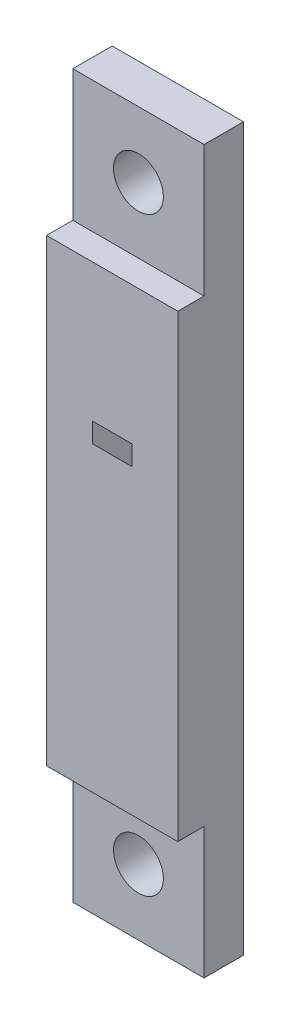
ISO-10303-21;
HEADER;
FILE_DESCRIPTION(('STEP AP214'),'2;1');
FILE_NAME('part.step','',(''),(''),'','','');
FILE_SCHEMA(('AUTOMOTIVE_DESIGN { 1 0 10303 214 1 1 1 1 }'));
ENDSEC;
DATA;
#1=APPLICATION_CONTEXT('core data for automotive mechanical design processes');
#2=APPLICATION_PROTOCOL_DEFINITION('international standard','automotive_design',2000,#1);
#3=PRODUCT_CONTEXT('',#1,'mechanical');
#4=PRODUCT('Part','Part','',(#3));
#5=PRODUCT_RELATED_PRODUCT_CATEGORY('part','',(#4));
#6=PRODUCT_DEFINITION_FORMATION('','',#4);
#7=PRODUCT_DEFINITION_CONTEXT('part definition',#1,'design');
#8=PRODUCT_DEFINITION('design','',#6,#7);
#9=PRODUCT_DEFINITION_SHAPE('','',#8);
#10=(LENGTH_UNIT() NAMED_UNIT(*) SI_UNIT(.MILLI.,.METRE.));
#11=(NAMED_UNIT(*) PLANE_ANGLE_UNIT() SI_UNIT($,.RADIAN.));
#12=(NAMED_UNIT(*) SI_UNIT($,.STERADIAN.) SOLID_ANGLE_UNIT());
#13=UNCERTAINTY_MEASURE_WITH_UNIT(LENGTH_MEASURE(1.E-05),#10,'distance_accuracy_value','');
#14=(GEOMETRIC_REPRESENTATION_CONTEXT(3) GLOBAL_UNCERTAINTY_ASSIGNED_CONTEXT((#13)) GLOBAL_UNIT_ASSIGNED_CONTEXT((#10,
#11,#12)) REPRESENTATION_CONTEXT('',''));
#15=CARTESIAN_POINT('',(0.,0.,0.));
#16=DIRECTION('',(0.,0.,1.));
#17=DIRECTION('',(1.,0.,0.));
#18=AXIS2_PLACEMENT_3D('',#15,#16,#17);
#19=CARTESIAN_POINT('',(0.,0.,13.5));
#20=DIRECTION('',(0.,0.,1.));
#21=DIRECTION('',(1.,0.,0.));
#22=AXIS2_PLACEMENT_3D('',#19,#20,#21);
#23=PLANE('',#22);
#24=CARTESIAN_POINT('',(-4.4209,22.5,13.5));
#25=DIRECTION('',(0.,0.,1.));
#26=DIRECTION('',(1.,0.,0.));
#27=AXIS2_PLACEMENT_3D('',#24,#25,#26);
#28=CIRCLE('',#27,1.9);
#29=CARTESIAN_POINT('',(-2.5209,22.5,13.5));
#30=VERTEX_POINT('',#29);
#31=EDGE_CURVE('E192',#30,#30,#28,.T.);
#32=ORIENTED_EDGE('',*,*,#31,.T.);
#33=EDGE_LOOP('',(#32));
#34=FACE_BOUND('',#33,.T.);
#35=CARTESIAN_POINT('',(-4.4209,-22.5,13.5));
#36=DIRECTION('',(0.,0.,1.));
#37=DIRECTION('',(1.,0.,0.));
#38=AXIS2_PLACEMENT_3D('',#35,#36,#37);
#39=CIRCLE('',#38,1.9);
#40=CARTESIAN_POINT('',(-2.5209,-22.5,13.5));
#41=VERTEX_POINT('',#40);
#42=EDGE_CURVE('E199',#41,#41,#39,.F.);
#43=ORIENTED_EDGE('',*,*,#42,.F.);
#44=EDGE_LOOP('',(#43));
#45=FACE_BOUND('',#44,.T.);
#46=DIRECTION('',(0.,-1.,0.));
#47=VECTOR('',#46,1.);
#48=CARTESIAN_POINT('',(0.579099999999996,0.,13.5));
#49=LINE('',#48,#47);
#50=CARTESIAN_POINT('',(0.579099999999992,27.5,13.5));
#51=VERTEX_POINT('',#50);
#52=CARTESIAN_POINT('',(0.579099999999999,-27.5,13.5));
#53=VERTEX_POINT('',#52);
#54=EDGE_CURVE('E218',#51,#53,#49,.T.);
#55=ORIENTED_EDGE('',*,*,#54,.T.);
#56=DIRECTION('',(1.,0.,0.));
#57=VECTOR('',#56,1.);
#58=CARTESIAN_POINT('',(0.,-27.5,13.5));
#59=LINE('',#58,#57);
#60=CARTESIAN_POINT('',(-9.4209,-27.5,13.5));
#61=VERTEX_POINT('',#60);
#62=EDGE_CURVE('E240',#61,#53,#59,.T.);
#63=ORIENTED_EDGE('',*,*,#62,.F.);
#64=DIRECTION('',(0.,-1.,0.));
#65=VECTOR('',#64,1.);
#66=CARTESIAN_POINT('',(-9.4209,0.,13.5));
#67=LINE('',#66,#65);
#68=CARTESIAN_POINT('',(-9.42090000000001,27.5,13.5));
#69=VERTEX_POINT('',#68);
#70=EDGE_CURVE('E249',#69,#61,#67,.T.);
#71=ORIENTED_EDGE('',*,*,#70,.F.);
#72=DIRECTION('',(1.,0.,0.));
#73=VECTOR('',#72,1.);
#74=CARTESIAN_POINT('',(0.,27.5,13.5));
#75=LINE('',#74,#73);
#76=EDGE_CURVE('E246',#69,#51,#75,.T.);
#77=ORIENTED_EDGE('',*,*,#76,.T.);
#78=EDGE_LOOP('',(#55,#63,#71,#77));
#79=FACE_BOUND('',#78,.T.);
#80=DIRECTION('',(0.,-1.,0.));
#81=VECTOR('',#80,1.);
#82=CARTESIAN_POINT('',(-5.9209,0.,13.5));
#83=LINE('',#82,#81);
#84=CARTESIAN_POINT('',(-5.9209,2.,13.5));
#85=VERTEX_POINT('',#84);
#86=CARTESIAN_POINT('',(-5.9209,-2.,13.5));
#87=VERTEX_POINT('',#86);
#88=EDGE_CURVE('E145',#85,#87,#83,.T.);
#89=ORIENTED_EDGE('',*,*,#88,.T.);
#90=DIRECTION('',(-1.,0.,0.));
#91=VECTOR('',#90,1.);
#92=CARTESIAN_POINT('',(0.,-2.,13.5));
#93=LINE('',#92,#91);
#94=CARTESIAN_POINT('',(-2.9209,-2.,13.5));
#95=VERTEX_POINT('',#94);
#96=EDGE_CURVE('E171',#95,#87,#93,.T.);
#97=ORIENTED_EDGE('',*,*,#96,.F.);
#98=DIRECTION('',(0.,-1.,0.));
#99=VECTOR('',#98,1.);
#100=CARTESIAN_POINT('',(-2.9209,0.,13.5));
#101=LINE('',#100,#99);
#102=CARTESIAN_POINT('',(-2.9209,2.,13.5));
#103=VERTEX_POINT('',#102);
#104=EDGE_CURVE('E183',#103,#95,#101,.T.);
#105=ORIENTED_EDGE('',*,*,#104,.F.);
#106=DIRECTION('',(-1.,0.,0.));
#107=VECTOR('',#106,1.);
#108=CARTESIAN_POINT('',(0.,2.,13.5));
#109=LINE('',#108,#107);
#110=EDGE_CURVE('E181',#103,#85,#109,.T.);
#111=ORIENTED_EDGE('',*,*,#110,.T.);
#112=EDGE_LOOP('',(#89,#97,#105,#111));
#113=FACE_BOUND('',#112,.T.);
#114=ADVANCED_FACE('F35',(#34,#45,#79,#113),#23,.F.);
#115=CARTESIAN_POINT('',(0.579099999999996,0.,18.5));
#116=DIRECTION('',(1.,0.,0.));
#117=DIRECTION('',(0.,1.,0.));
#118=AXIS2_PLACEMENT_3D('',#115,#116,#117);
#119=PLANE('',#118);
#120=DIRECTION('',(0.,1.,0.));
#121=VECTOR('',#120,1.);
#122=CARTESIAN_POINT('',(0.579099999999996,0.,16.5));
#123=LINE('',#122,#121);
#124=CARTESIAN_POINT('',(0.579099999999993,17.5,16.5));
#125=VERTEX_POINT('',#124);
#126=CARTESIAN_POINT('',(0.579099999999992,27.5,16.5));
#127=VERTEX_POINT('',#126);
#128=EDGE_CURVE('E206',#125,#127,#123,.T.);
#129=ORIENTED_EDGE('',*,*,#128,.F.);
#130=DIRECTION('',(0.,0.,1.));
#131=VECTOR('',#130,1.);
#132=CARTESIAN_POINT('',(0.579099999999993,17.5,16.5));
#133=LINE('',#132,#131);
#134=CARTESIAN_POINT('',(0.579099999999993,17.5,18.5));
#135=VERTEX_POINT('',#134);
#136=EDGE_CURVE('E214',#125,#135,#133,.T.);
#137=ORIENTED_EDGE('',*,*,#136,.T.);
#138=DIRECTION('',(0.,-1.,0.));
#139=VECTOR('',#138,1.);
#140=CARTESIAN_POINT('',(0.579099999999996,0.,18.5));
#141=LINE('',#140,#139);
#142=CARTESIAN_POINT('',(0.579099999999998,-17.5,18.5));
#143=VERTEX_POINT('',#142);
#144=EDGE_CURVE('E236',#135,#143,#141,.T.);
#145=ORIENTED_EDGE('',*,*,#144,.T.);
#146=DIRECTION('',(0.,0.,1.));
#147=VECTOR('',#146,1.);
#148=CARTESIAN_POINT('',(0.579099999999998,-17.5,16.5));
#149=LINE('',#148,#147);
#150=CARTESIAN_POINT('',(0.579099999999998,-17.5,16.5));
#151=VERTEX_POINT('',#150);
#152=EDGE_CURVE('E231',#151,#143,#149,.T.);
#153=ORIENTED_EDGE('',*,*,#152,.F.);
#154=DIRECTION('',(0.,1.,0.));
#155=VECTOR('',#154,1.);
#156=CARTESIAN_POINT('',(0.579099999999996,0.,16.5));
#157=LINE('',#156,#155);
#158=CARTESIAN_POINT('',(0.579099999999999,-27.5,16.5));
#159=VERTEX_POINT('',#158);
#160=EDGE_CURVE('E221',#159,#151,#157,.T.);
#161=ORIENTED_EDGE('',*,*,#160,.F.);
#162=DIRECTION('',(0.,0.,-1.));
#163=VECTOR('',#162,1.);
#164=CARTESIAN_POINT('',(0.579099999999999,-27.5,18.5));
#165=LINE('',#164,#163);
#166=EDGE_CURVE('E243',#159,#53,#165,.T.);
#167=ORIENTED_EDGE('',*,*,#166,.T.);
#168=ORIENTED_EDGE('',*,*,#54,.F.);
#169=DIRECTION('',(0.,0.,-1.));
#170=VECTOR('',#169,1.);
#171=CARTESIAN_POINT('',(0.579099999999992,27.5,18.5));
#172=LINE('',#171,#170);
#173=EDGE_CURVE('E11',#127,#51,#172,.T.);
#174=ORIENTED_EDGE('',*,*,#173,.F.);
#175=EDGE_LOOP('',(#129,#137,#145,#153,#161,#167,#168,#174));
#176=FACE_BOUND('',#175,.T.);
#177=ADVANCED_FACE('F37',(#176),#119,.T.);
#178=CARTESIAN_POINT('',(0.,27.5,18.5));
#179=DIRECTION('',(0.,1.,0.));
#180=DIRECTION('',(0.,0.,1.));
#181=AXIS2_PLACEMENT_3D('',#178,#179,#180);
#182=PLANE('',#181);
#183=DIRECTION('',(0.,0.,-1.));
#184=VECTOR('',#183,1.);
#185=CARTESIAN_POINT('',(-9.42090000000001,27.5,18.5));
#186=LINE('',#185,#184);
#187=CARTESIAN_POINT('',(-9.42090000000001,27.5,16.5));
#188=VERTEX_POINT('',#187);
#189=EDGE_CURVE('E43',#188,#69,#186,.T.);
#190=ORIENTED_EDGE('',*,*,#189,.F.);
#191=DIRECTION('',(-1.,0.,0.));
#192=VECTOR('',#191,1.);
#193=CARTESIAN_POINT('',(0.,27.5,16.5));
#194=LINE('',#193,#192);
#195=EDGE_CURVE('E209',#127,#188,#194,.T.);
#196=ORIENTED_EDGE('',*,*,#195,.F.);
#197=ORIENTED_EDGE('',*,*,#173,.T.);
#198=ORIENTED_EDGE('',*,*,#76,.F.);
#199=EDGE_LOOP('',(#190,#196,#197,#198));
#200=FACE_BOUND('',#199,.T.);
#201=ADVANCED_FACE('F268',(#200),#182,.T.);
#202=CARTESIAN_POINT('',(-9.4209,0.,18.5));
#203=DIRECTION('',(1.,0.,0.));
#204=DIRECTION('',(0.,1.,0.));
#205=AXIS2_PLACEMENT_3D('',#202,#203,#204);
#206=PLANE('',#205);
#207=DIRECTION('',(0.,0.,1.));
#208=VECTOR('',#207,1.);
#209=CARTESIAN_POINT('',(-9.42090000000001,17.5,16.5));
#210=LINE('',#209,#208);
#211=CARTESIAN_POINT('',(-9.42090000000001,17.5,16.5));
#212=VERTEX_POINT('',#211);
#213=CARTESIAN_POINT('',(-9.42090000000001,17.5,18.5));
#214=VERTEX_POINT('',#213);
#215=EDGE_CURVE('E58',#212,#214,#210,.T.);
#216=ORIENTED_EDGE('',*,*,#215,.F.);
#217=DIRECTION('',(0.,-1.,0.));
#218=VECTOR('',#217,1.);
#219=CARTESIAN_POINT('',(-9.4209,0.,16.5));
#220=LINE('',#219,#218);
#221=EDGE_CURVE('E211',#188,#212,#220,.T.);
#222=ORIENTED_EDGE('',*,*,#221,.F.);
#223=ORIENTED_EDGE('',*,*,#189,.T.);
#224=ORIENTED_EDGE('',*,*,#70,.T.);
#225=DIRECTION('',(0.,0.,-1.));
#226=VECTOR('',#225,1.);
#227=CARTESIAN_POINT('',(-9.4209,-27.5,18.5));
#228=LINE('',#227,#226);
#229=CARTESIAN_POINT('',(-9.4209,-27.5,16.5));
#230=VERTEX_POINT('',#229);
#231=EDGE_CURVE('E255',#230,#61,#228,.T.);
#232=ORIENTED_EDGE('',*,*,#231,.F.);
#233=DIRECTION('',(0.,-1.,0.));
#234=VECTOR('',#233,1.);
#235=CARTESIAN_POINT('',(-9.4209,0.,16.5));
#236=LINE('',#235,#234);
#237=CARTESIAN_POINT('',(-9.4209,-17.5,16.5));
#238=VERTEX_POINT('',#237);
#239=EDGE_CURVE('E227',#238,#230,#236,.T.);
#240=ORIENTED_EDGE('',*,*,#239,.F.);
#241=DIRECTION('',(0.,0.,1.));
#242=VECTOR('',#241,1.);
#243=CARTESIAN_POINT('',(-9.4209,-17.5,16.5));
#244=LINE('',#243,#242);
#245=CARTESIAN_POINT('',(-9.4209,-17.5,18.5));
#246=VERTEX_POINT('',#245);
#247=EDGE_CURVE('E216',#238,#246,#244,.T.);
#248=ORIENTED_EDGE('',*,*,#247,.T.);
#249=DIRECTION('',(0.,-1.,0.));
#250=VECTOR('',#249,1.);
#251=CARTESIAN_POINT('',(-9.4209,0.,18.5));
#252=LINE('',#251,#250);
#253=EDGE_CURVE('E239',#214,#246,#252,.T.);
#254=ORIENTED_EDGE('',*,*,#253,.F.);
#255=EDGE_LOOP('',(#216,#222,#223,#224,#232,#240,#248,#254));
#256=FACE_BOUND('',#255,.T.);
#257=ADVANCED_FACE('F260',(#256),#206,.F.);
#258=CARTESIAN_POINT('',(0.,-27.5,18.5));
#259=DIRECTION('',(0.,1.,0.));
#260=DIRECTION('',(0.,0.,1.));
#261=AXIS2_PLACEMENT_3D('',#258,#259,#260);
#262=PLANE('',#261);
#263=DIRECTION('',(1.,0.,0.));
#264=VECTOR('',#263,1.);
#265=CARTESIAN_POINT('',(0.,-27.5,16.5));
#266=LINE('',#265,#264);
#267=EDGE_CURVE('E229',#230,#159,#266,.T.);
#268=ORIENTED_EDGE('',*,*,#267,.F.);
#269=ORIENTED_EDGE('',*,*,#231,.T.);
#270=ORIENTED_EDGE('',*,*,#62,.T.);
#271=ORIENTED_EDGE('',*,*,#166,.F.);
#272=EDGE_LOOP('',(#268,#269,#270,#271));
#273=FACE_BOUND('',#272,.T.);
#274=ADVANCED_FACE('F278',(#273),#262,.F.);
#275=CARTESIAN_POINT('',(0.,0.,18.5));
#276=DIRECTION('',(0.,0.,1.));
#277=DIRECTION('',(1.,0.,0.));
#278=AXIS2_PLACEMENT_3D('',#275,#276,#277);
#279=PLANE('',#278);
#280=DIRECTION('',(0.,-1.,0.));
#281=VECTOR('',#280,1.);
#282=CARTESIAN_POINT('',(-5.9209,0.,18.5));
#283=LINE('',#282,#281);
#284=CARTESIAN_POINT('',(-5.9209,7.,18.5));
#285=VERTEX_POINT('',#284);
#286=CARTESIAN_POINT('',(-5.9209,5.5,18.5));
#287=VERTEX_POINT('',#286);
#288=EDGE_CURVE('E152',#285,#287,#283,.T.);
#289=ORIENTED_EDGE('',*,*,#288,.F.);
#290=DIRECTION('',(1.,0.,0.));
#291=VECTOR('',#290,1.);
#292=CARTESIAN_POINT('',(-5.9209,7.,18.5));
#293=LINE('',#292,#291);
#294=CARTESIAN_POINT('',(-2.9209,7.,18.5));
#295=VERTEX_POINT('',#294);
#296=EDGE_CURVE('E135',#285,#295,#293,.T.);
#297=ORIENTED_EDGE('',*,*,#296,.T.);
#298=DIRECTION('',(0.,-1.,0.));
#299=VECTOR('',#298,1.);
#300=CARTESIAN_POINT('',(-2.9209,0.,18.5));
#301=LINE('',#300,#299);
#302=CARTESIAN_POINT('',(-2.9209,5.5,18.5));
#303=VERTEX_POINT('',#302);
#304=EDGE_CURVE('E164',#295,#303,#301,.T.);
#305=ORIENTED_EDGE('',*,*,#304,.T.);
#306=DIRECTION('',(1.,0.,0.));
#307=VECTOR('',#306,1.);
#308=CARTESIAN_POINT('',(-5.9209,5.5,18.5));
#309=LINE('',#308,#307);
#310=EDGE_CURVE('E146',#287,#303,#309,.T.);
#311=ORIENTED_EDGE('',*,*,#310,.F.);
#312=EDGE_LOOP('',(#289,#297,#305,#311));
#313=FACE_BOUND('',#312,.T.);
#314=ORIENTED_EDGE('',*,*,#144,.F.);
#315=DIRECTION('',(-1.,0.,0.));
#316=VECTOR('',#315,1.);
#317=CARTESIAN_POINT('',(0.,17.5,18.5));
#318=LINE('',#317,#316);
#319=EDGE_CURVE('E207',#135,#214,#318,.T.);
#320=ORIENTED_EDGE('',*,*,#319,.T.);
#321=ORIENTED_EDGE('',*,*,#253,.T.);
#322=DIRECTION('',(-1.,0.,0.));
#323=VECTOR('',#322,1.);
#324=CARTESIAN_POINT('',(0.,-17.5,18.5));
#325=LINE('',#324,#323);
#326=EDGE_CURVE('E195',#143,#246,#325,.T.);
#327=ORIENTED_EDGE('',*,*,#326,.F.);
#328=EDGE_LOOP('',(#314,#320,#321,#327));
#329=FACE_BOUND('',#328,.T.);
#330=ADVANCED_FACE('F158',(#313,#329),#279,.T.);
#331=CARTESIAN_POINT('',(0.,-17.5,16.5));
#332=DIRECTION('',(0.,1.,0.));
#333=DIRECTION('',(-1.,0.,0.));
#334=AXIS2_PLACEMENT_3D('',#331,#332,#333);
#335=PLANE('',#334);
#336=ORIENTED_EDGE('',*,*,#326,.T.);
#337=ORIENTED_EDGE('',*,*,#247,.F.);
#338=DIRECTION('',(-1.,0.,0.));
#339=VECTOR('',#338,1.);
#340=CARTESIAN_POINT('',(0.,-17.5,16.5));
#341=LINE('',#340,#339);
#342=EDGE_CURVE('E224',#151,#238,#341,.T.);
#343=ORIENTED_EDGE('',*,*,#342,.F.);
#344=ORIENTED_EDGE('',*,*,#152,.T.);
#345=EDGE_LOOP('',(#336,#337,#343,#344));
#346=FACE_BOUND('',#345,.T.);
#347=ADVANCED_FACE('F284',(#346),#335,.F.);
#348=CARTESIAN_POINT('',(0.,0.,16.5));
#349=DIRECTION('',(0.,0.,1.));
#350=DIRECTION('',(1.,0.,0.));
#351=AXIS2_PLACEMENT_3D('',#348,#349,#350);
#352=PLANE('',#351);
#353=CARTESIAN_POINT('',(-4.4209,-22.5,16.5));
#354=DIRECTION('',(0.,0.,1.));
#355=DIRECTION('',(1.,0.,0.));
#356=AXIS2_PLACEMENT_3D('',#353,#354,#355);
#357=CIRCLE('',#356,1.9);
#358=CARTESIAN_POINT('',(-2.5209,-22.5,16.5));
#359=VERTEX_POINT('',#358);
#360=EDGE_CURVE('E190',#359,#359,#357,.F.);
#361=ORIENTED_EDGE('',*,*,#360,.T.);
#362=EDGE_LOOP('',(#361));
#363=FACE_BOUND('',#362,.T.);
#364=ORIENTED_EDGE('',*,*,#160,.T.);
#365=ORIENTED_EDGE('',*,*,#342,.T.);
#366=ORIENTED_EDGE('',*,*,#239,.T.);
#367=ORIENTED_EDGE('',*,*,#267,.T.);
#368=EDGE_LOOP('',(#364,#365,#366,#367));
#369=FACE_BOUND('',#368,.T.);
#370=ADVANCED_FACE('F282',(#363,#369),#352,.T.);
#371=CARTESIAN_POINT('',(0.,17.5,16.5));
#372=DIRECTION('',(0.,1.,0.));
#373=DIRECTION('',(0.,0.,1.));
#374=AXIS2_PLACEMENT_3D('',#371,#372,#373);
#375=PLANE('',#374);
#376=ORIENTED_EDGE('',*,*,#319,.F.);
#377=ORIENTED_EDGE('',*,*,#136,.F.);
#378=DIRECTION('',(-1.,0.,0.));
#379=VECTOR('',#378,1.);
#380=CARTESIAN_POINT('',(0.,17.5,16.5));
#381=LINE('',#380,#379);
#382=EDGE_CURVE('E204',#125,#212,#381,.T.);
#383=ORIENTED_EDGE('',*,*,#382,.T.);
#384=ORIENTED_EDGE('',*,*,#215,.T.);
#385=EDGE_LOOP('',(#376,#377,#383,#384));
#386=FACE_BOUND('',#385,.T.);
#387=ADVANCED_FACE('F288',(#386),#375,.T.);
#388=CARTESIAN_POINT('',(0.,0.,16.5));
#389=DIRECTION('',(0.,0.,1.));
#390=DIRECTION('',(1.,0.,0.));
#391=AXIS2_PLACEMENT_3D('',#388,#389,#390);
#392=PLANE('',#391);
#393=CARTESIAN_POINT('',(-4.4209,22.5,16.5));
#394=DIRECTION('',(0.,0.,1.));
#395=DIRECTION('',(1.,0.,0.));
#396=AXIS2_PLACEMENT_3D('',#393,#394,#395);
#397=CIRCLE('',#396,1.9);
#398=CARTESIAN_POINT('',(-2.5209,22.5,16.5));
#399=VERTEX_POINT('',#398);
#400=EDGE_CURVE('E196',#399,#399,#397,.T.);
#401=ORIENTED_EDGE('',*,*,#400,.F.);
#402=EDGE_LOOP('',(#401));
#403=FACE_BOUND('',#402,.T.);
#404=ORIENTED_EDGE('',*,*,#382,.F.);
#405=ORIENTED_EDGE('',*,*,#128,.T.);
#406=ORIENTED_EDGE('',*,*,#195,.T.);
#407=ORIENTED_EDGE('',*,*,#221,.T.);
#408=EDGE_LOOP('',(#404,#405,#406,#407));
#409=FACE_BOUND('',#408,.T.);
#410=ADVANCED_FACE('F290',(#403,#409),#392,.T.);
#411=CARTESIAN_POINT('',(-4.4209,22.5,13.5));
#412=DIRECTION('',(0.,0.,1.));
#413=DIRECTION('',(1.,0.,0.));
#414=AXIS2_PLACEMENT_3D('',#411,#412,#413);
#415=CYLINDRICAL_SURFACE('',#414,1.9);
#416=ORIENTED_EDGE('',*,*,#31,.F.);
#417=EDGE_LOOP('',(#416));
#418=FACE_BOUND('',#417,.T.);
#419=ORIENTED_EDGE('',*,*,#400,.T.);
#420=EDGE_LOOP('',(#419));
#421=FACE_BOUND('',#420,.T.);
#422=ADVANCED_FACE('F292',(#418,#421),#415,.F.);
#423=CARTESIAN_POINT('',(-4.4209,-22.5,13.5));
#424=DIRECTION('',(0.,0.,1.));
#425=DIRECTION('',(1.,0.,0.));
#426=AXIS2_PLACEMENT_3D('',#423,#424,#425);
#427=CYLINDRICAL_SURFACE('',#426,1.9);
#428=ORIENTED_EDGE('',*,*,#42,.T.);
#429=EDGE_LOOP('',(#428));
#430=FACE_BOUND('',#429,.T.);
#431=ORIENTED_EDGE('',*,*,#360,.F.);
#432=EDGE_LOOP('',(#431));
#433=FACE_BOUND('',#432,.T.);
#434=ADVANCED_FACE('F299',(#430,#433),#427,.F.);
#435=CARTESIAN_POINT('',(-5.9209,0.,15.));
#436=DIRECTION('',(1.,0.,0.));
#437=DIRECTION('',(0.,1.,0.));
#438=AXIS2_PLACEMENT_3D('',#435,#436,#437);
#439=PLANE('',#438);
#440=ORIENTED_EDGE('',*,*,#88,.F.);
#441=DIRECTION('',(0.,0.707106781186548,0.707106781186547));
#442=VECTOR('',#441,1.);
#443=CARTESIAN_POINT('',(-5.9209,-5.75,5.75));
#444=LINE('',#443,#442);
#445=EDGE_CURVE('E138',#85,#285,#444,.T.);
#446=ORIENTED_EDGE('',*,*,#445,.T.);
#447=ORIENTED_EDGE('',*,*,#288,.T.);
#448=DIRECTION('',(0.,0.707106781186548,0.707106781186548));
#449=VECTOR('',#448,1.);
#450=CARTESIAN_POINT('',(-5.9209,-6.5,6.5));
#451=LINE('',#450,#449);
#452=CARTESIAN_POINT('',(-5.9209,2.,15.));
#453=VERTEX_POINT('',#452);
#454=EDGE_CURVE('E156',#453,#287,#451,.T.);
#455=ORIENTED_EDGE('',*,*,#454,.F.);
#456=DIRECTION('',(0.,-1.,0.));
#457=VECTOR('',#456,1.);
#458=CARTESIAN_POINT('',(-5.9209,0.,15.));
#459=LINE('',#458,#457);
#460=CARTESIAN_POINT('',(-5.9209,-2.,15.));
#461=VERTEX_POINT('',#460);
#462=EDGE_CURVE('E168',#453,#461,#459,.T.);
#463=ORIENTED_EDGE('',*,*,#462,.T.);
#464=DIRECTION('',(0.,0.,-1.));
#465=VECTOR('',#464,1.);
#466=CARTESIAN_POINT('',(-5.9209,-2.,15.));
#467=LINE('',#466,#465);
#468=EDGE_CURVE('E188',#461,#87,#467,.T.);
#469=ORIENTED_EDGE('',*,*,#468,.T.);
#470=EDGE_LOOP('',(#440,#446,#447,#455,#463,#469));
#471=FACE_BOUND('',#470,.T.);
#472=ADVANCED_FACE('F150',(#471),#439,.T.);
#473=CARTESIAN_POINT('',(0.,-2.,15.));
#474=DIRECTION('',(0.,-1.,0.));
#475=DIRECTION('',(0.,0.,-1.));
#476=AXIS2_PLACEMENT_3D('',#473,#474,#475);
#477=PLANE('',#476);
#478=ORIENTED_EDGE('',*,*,#96,.T.);
#479=ORIENTED_EDGE('',*,*,#468,.F.);
#480=DIRECTION('',(-1.,0.,0.));
#481=VECTOR('',#480,1.);
#482=CARTESIAN_POINT('',(0.,-2.,15.));
#483=LINE('',#482,#481);
#484=CARTESIAN_POINT('',(-2.9209,-2.,15.));
#485=VERTEX_POINT('',#484);
#486=EDGE_CURVE('E176',#485,#461,#483,.T.);
#487=ORIENTED_EDGE('',*,*,#486,.F.);
#488=DIRECTION('',(0.,0.,-1.));
#489=VECTOR('',#488,1.);
#490=CARTESIAN_POINT('',(-2.9209,-2.,15.));
#491=LINE('',#490,#489);
#492=EDGE_CURVE('E179',#485,#95,#491,.T.);
#493=ORIENTED_EDGE('',*,*,#492,.T.);
#494=EDGE_LOOP('',(#478,#479,#487,#493));
#495=FACE_BOUND('',#494,.T.);
#496=ADVANCED_FACE('F391',(#495),#477,.F.);
#497=CARTESIAN_POINT('',(-2.9209,0.,15.));
#498=DIRECTION('',(1.,0.,0.));
#499=DIRECTION('',(0.,1.,0.));
#500=AXIS2_PLACEMENT_3D('',#497,#498,#499);
#501=PLANE('',#500);
#502=ORIENTED_EDGE('',*,*,#104,.T.);
#503=ORIENTED_EDGE('',*,*,#492,.F.);
#504=DIRECTION('',(0.,-1.,0.));
#505=VECTOR('',#504,1.);
#506=CARTESIAN_POINT('',(-2.9209,0.,15.));
#507=LINE('',#506,#505);
#508=CARTESIAN_POINT('',(-2.9209,2.,15.));
#509=VERTEX_POINT('',#508);
#510=EDGE_CURVE('E173',#509,#485,#507,.T.);
#511=ORIENTED_EDGE('',*,*,#510,.F.);
#512=DIRECTION('',(0.,0.707106781186548,0.707106781186548));
#513=VECTOR('',#512,1.);
#514=CARTESIAN_POINT('',(-2.9209,-6.5,6.5));
#515=LINE('',#514,#513);
#516=EDGE_CURVE('E50',#509,#303,#515,.T.);
#517=ORIENTED_EDGE('',*,*,#516,.T.);
#518=ORIENTED_EDGE('',*,*,#304,.F.);
#519=DIRECTION('',(0.,0.707106781186548,0.707106781186547));
#520=VECTOR('',#519,1.);
#521=CARTESIAN_POINT('',(-2.9209,-5.75,5.75));
#522=LINE('',#521,#520);
#523=EDGE_CURVE('E141',#103,#295,#522,.T.);
#524=ORIENTED_EDGE('',*,*,#523,.F.);
#525=EDGE_LOOP('',(#502,#503,#511,#517,#518,#524));
#526=FACE_BOUND('',#525,.T.);
#527=ADVANCED_FACE('F401',(#526),#501,.F.);
#528=CARTESIAN_POINT('',(0.,0.,15.));
#529=DIRECTION('',(0.,0.,-1.));
#530=DIRECTION('',(-1.,0.,0.));
#531=AXIS2_PLACEMENT_3D('',#528,#529,#530);
#532=PLANE('',#531);
#533=ORIENTED_EDGE('',*,*,#462,.F.);
#534=DIRECTION('',(-1.,0.,0.));
#535=VECTOR('',#534,1.);
#536=CARTESIAN_POINT('',(0.,2.,15.));
#537=LINE('',#536,#535);
#538=EDGE_CURVE('E170',#509,#453,#537,.T.);
#539=ORIENTED_EDGE('',*,*,#538,.F.);
#540=ORIENTED_EDGE('',*,*,#510,.T.);
#541=ORIENTED_EDGE('',*,*,#486,.T.);
#542=EDGE_LOOP('',(#533,#539,#540,#541));
#543=FACE_BOUND('',#542,.T.);
#544=ADVANCED_FACE('F409',(#543),#532,.T.);
#545=CARTESIAN_POINT('',(-5.9209,-5.75,5.75));
#546=DIRECTION('',(0.,0.707106781186547,-0.707106781186548));
#547=DIRECTION('',(0.,0.707106781186548,0.707106781186547));
#548=AXIS2_PLACEMENT_3D('',#545,#546,#547);
#549=PLANE('',#548);
#550=ORIENTED_EDGE('',*,*,#523,.T.);
#551=ORIENTED_EDGE('',*,*,#296,.F.);
#552=ORIENTED_EDGE('',*,*,#445,.F.);
#553=ORIENTED_EDGE('',*,*,#110,.F.);
#554=EDGE_LOOP('',(#550,#551,#552,#553));
#555=FACE_BOUND('',#554,.T.);
#556=ADVANCED_FACE('F137',(#555),#549,.F.);
#557=CARTESIAN_POINT('',(-5.9209,-6.5,6.5));
#558=DIRECTION('',(0.,0.707106781186547,-0.707106781186547));
#559=DIRECTION('',(0.,0.707106781186548,0.707106781186548));
#560=AXIS2_PLACEMENT_3D('',#557,#558,#559);
#561=PLANE('',#560);
#562=ORIENTED_EDGE('',*,*,#516,.F.);
#563=ORIENTED_EDGE('',*,*,#538,.T.);
#564=ORIENTED_EDGE('',*,*,#454,.T.);
#565=ORIENTED_EDGE('',*,*,#310,.T.);
#566=EDGE_LOOP('',(#562,#563,#564,#565));
#567=FACE_BOUND('',#566,.T.);
#568=ADVANCED_FACE('F430',(#567),#561,.T.);
#569=CLOSED_SHELL('',(#114,#177,#201,#257,#274,#330,#347,#370,#387,#410,#422,#434,#472,#496,
#527,#544,#556,#568));
#570=MANIFOLD_SOLID_BREP('B2',#569);
#571=ADVANCED_BREP_SHAPE_REPRESENTATION('',(#18,#570),#14);
#572=SHAPE_DEFINITION_REPRESENTATION(#9,#571);
ENDSEC;
END-ISO-10303-21;
